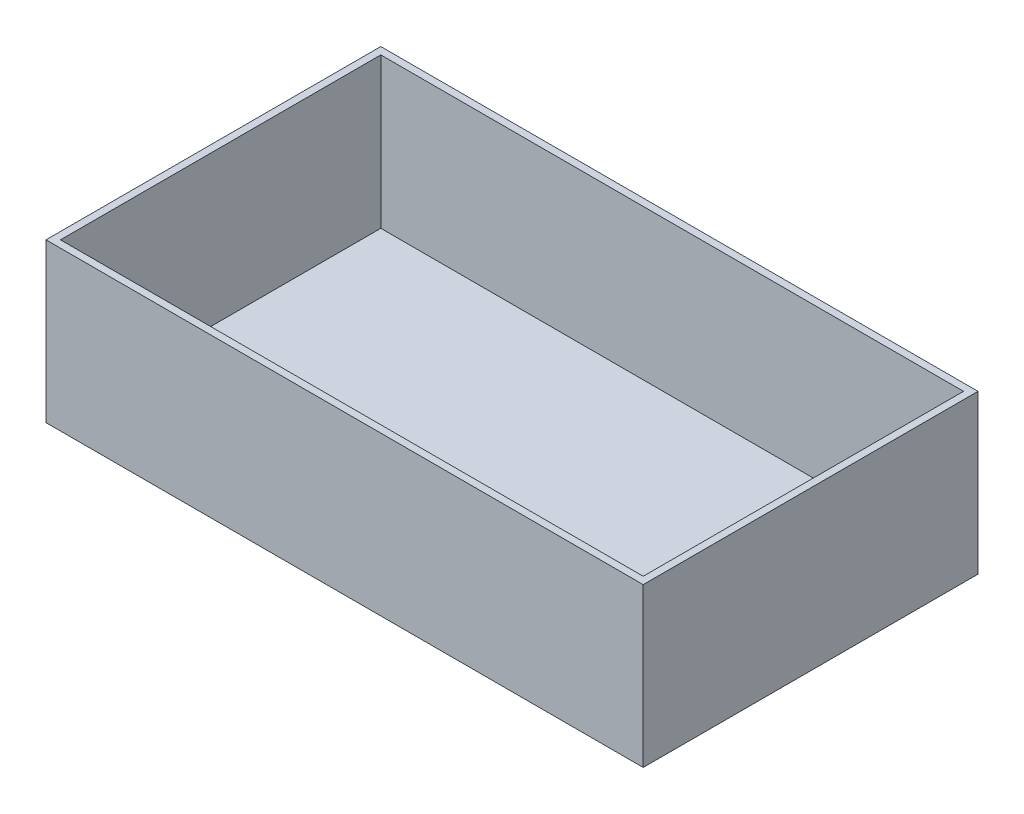
ISO-10303-21;
HEADER;
FILE_DESCRIPTION(('STEP AP214'),'2;1');
FILE_NAME('part.step','',(''),(''),'','','');
FILE_SCHEMA(('AUTOMOTIVE_DESIGN { 1 0 10303 214 1 1 1 1 }'));
ENDSEC;
DATA;
#1=APPLICATION_CONTEXT('core data for automotive mechanical design processes');
#2=APPLICATION_PROTOCOL_DEFINITION('international standard','automotive_design',2000,#1);
#3=PRODUCT_CONTEXT('',#1,'mechanical');
#4=PRODUCT('Part','Part','',(#3));
#5=PRODUCT_RELATED_PRODUCT_CATEGORY('part','',(#4));
#6=PRODUCT_DEFINITION_FORMATION('','',#4);
#7=PRODUCT_DEFINITION_CONTEXT('part definition',#1,'design');
#8=PRODUCT_DEFINITION('design','',#6,#7);
#9=PRODUCT_DEFINITION_SHAPE('','',#8);
#10=(LENGTH_UNIT() NAMED_UNIT(*) SI_UNIT(.MILLI.,.METRE.));
#11=(NAMED_UNIT(*) PLANE_ANGLE_UNIT() SI_UNIT($,.RADIAN.));
#12=(NAMED_UNIT(*) SI_UNIT($,.STERADIAN.) SOLID_ANGLE_UNIT());
#13=UNCERTAINTY_MEASURE_WITH_UNIT(LENGTH_MEASURE(1.E-05),#10,'distance_accuracy_value','');
#14=(GEOMETRIC_REPRESENTATION_CONTEXT(3) GLOBAL_UNCERTAINTY_ASSIGNED_CONTEXT((#13)) GLOBAL_UNIT_ASSIGNED_CONTEXT((#10,
#11,#12)) REPRESENTATION_CONTEXT('',''));
#15=CARTESIAN_POINT('',(0.,0.,0.));
#16=DIRECTION('',(0.,0.,1.));
#17=DIRECTION('',(1.,0.,0.));
#18=AXIS2_PLACEMENT_3D('',#15,#16,#17);
#19=CARTESIAN_POINT('',(660.,350.,370.));
#20=DIRECTION('',(-1.,0.,0.));
#21=DIRECTION('',(0.,0.,1.));
#22=AXIS2_PLACEMENT_3D('',#19,#20,#21);
#23=PLANE('',#22);
#24=DIRECTION('',(0.,0.,-1.));
#25=VECTOR('',#24,1.);
#26=CARTESIAN_POINT('',(660.,0.,370.));
#27=LINE('',#26,#25);
#28=CARTESIAN_POINT('',(660.,0.,370.));
#29=VERTEX_POINT('',#28);
#30=CARTESIAN_POINT('',(660.,0.,-370.));
#31=VERTEX_POINT('',#30);
#32=EDGE_CURVE('E140',#29,#31,#27,.T.);
#33=ORIENTED_EDGE('',*,*,#32,.T.);
#34=DIRECTION('',(0.,-1.,0.));
#35=VECTOR('',#34,1.);
#36=CARTESIAN_POINT('',(660.,350.,-370.));
#37=LINE('',#36,#35);
#38=CARTESIAN_POINT('',(660.,350.,-370.));
#39=VERTEX_POINT('',#38);
#40=EDGE_CURVE('E11',#39,#31,#37,.T.);
#41=ORIENTED_EDGE('',*,*,#40,.F.);
#42=DIRECTION('',(0.,0.,-1.));
#43=VECTOR('',#42,1.);
#44=CARTESIAN_POINT('',(660.,350.,370.));
#45=LINE('',#44,#43);
#46=CARTESIAN_POINT('',(660.,350.,370.));
#47=VERTEX_POINT('',#46);
#48=EDGE_CURVE('E144',#47,#39,#45,.T.);
#49=ORIENTED_EDGE('',*,*,#48,.F.);
#50=DIRECTION('',(0.,-1.,0.));
#51=VECTOR('',#50,1.);
#52=CARTESIAN_POINT('',(660.,350.,370.));
#53=LINE('',#52,#51);
#54=EDGE_CURVE('E150',#47,#29,#53,.T.);
#55=ORIENTED_EDGE('',*,*,#54,.T.);
#56=EDGE_LOOP('',(#33,#41,#49,#55));
#57=FACE_BOUND('',#56,.T.);
#58=ADVANCED_FACE('F32',(#57),#23,.F.);
#59=CARTESIAN_POINT('',(-660.,350.,-370.));
#60=DIRECTION('',(0.,0.,1.));
#61=DIRECTION('',(1.,0.,0.));
#62=AXIS2_PLACEMENT_3D('',#59,#60,#61);
#63=PLANE('',#62);
#64=DIRECTION('',(-1.,0.,0.));
#65=VECTOR('',#64,1.);
#66=CARTESIAN_POINT('',(-660.,0.,-370.));
#67=LINE('',#66,#65);
#68=CARTESIAN_POINT('',(-660.,0.,-370.));
#69=VERTEX_POINT('',#68);
#70=EDGE_CURVE('E153',#31,#69,#67,.T.);
#71=ORIENTED_EDGE('',*,*,#70,.T.);
#72=DIRECTION('',(0.,-1.,0.));
#73=VECTOR('',#72,1.);
#74=CARTESIAN_POINT('',(-660.,350.,-370.));
#75=LINE('',#74,#73);
#76=CARTESIAN_POINT('',(-660.,350.,-370.));
#77=VERTEX_POINT('',#76);
#78=EDGE_CURVE('E39',#77,#69,#75,.T.);
#79=ORIENTED_EDGE('',*,*,#78,.F.);
#80=DIRECTION('',(-1.,0.,0.));
#81=VECTOR('',#80,1.);
#82=CARTESIAN_POINT('',(-660.,350.,-370.));
#83=LINE('',#82,#81);
#84=EDGE_CURVE('E83',#39,#77,#83,.T.);
#85=ORIENTED_EDGE('',*,*,#84,.F.);
#86=ORIENTED_EDGE('',*,*,#40,.T.);
#87=EDGE_LOOP('',(#71,#79,#85,#86));
#88=FACE_BOUND('',#87,.T.);
#89=ADVANCED_FACE('F182',(#88),#63,.F.);
#90=CARTESIAN_POINT('',(-660.,350.,370.));
#91=DIRECTION('',(1.,0.,0.));
#92=DIRECTION('',(0.,0.,-1.));
#93=AXIS2_PLACEMENT_3D('',#90,#91,#92);
#94=PLANE('',#93);
#95=DIRECTION('',(0.,0.,1.));
#96=VECTOR('',#95,1.);
#97=CARTESIAN_POINT('',(-660.,0.,370.));
#98=LINE('',#97,#96);
#99=CARTESIAN_POINT('',(-660.,0.,370.));
#100=VERTEX_POINT('',#99);
#101=EDGE_CURVE('E155',#69,#100,#98,.T.);
#102=ORIENTED_EDGE('',*,*,#101,.T.);
#103=DIRECTION('',(0.,-1.,0.));
#104=VECTOR('',#103,1.);
#105=CARTESIAN_POINT('',(-660.,350.,370.));
#106=LINE('',#105,#104);
#107=CARTESIAN_POINT('',(-660.,350.,370.));
#108=VERTEX_POINT('',#107);
#109=EDGE_CURVE('E159',#108,#100,#106,.T.);
#110=ORIENTED_EDGE('',*,*,#109,.F.);
#111=DIRECTION('',(0.,0.,1.));
#112=VECTOR('',#111,1.);
#113=CARTESIAN_POINT('',(-660.,350.,370.));
#114=LINE('',#113,#112);
#115=EDGE_CURVE('E147',#77,#108,#114,.T.);
#116=ORIENTED_EDGE('',*,*,#115,.F.);
#117=ORIENTED_EDGE('',*,*,#78,.T.);
#118=EDGE_LOOP('',(#102,#110,#116,#117));
#119=FACE_BOUND('',#118,.T.);
#120=ADVANCED_FACE('F164',(#119),#94,.F.);
#121=CARTESIAN_POINT('',(-660.,350.,370.));
#122=DIRECTION('',(0.,0.,-1.));
#123=DIRECTION('',(-1.,0.,0.));
#124=AXIS2_PLACEMENT_3D('',#121,#122,#123);
#125=PLANE('',#124);
#126=DIRECTION('',(1.,0.,0.));
#127=VECTOR('',#126,1.);
#128=CARTESIAN_POINT('',(-660.,0.,370.));
#129=LINE('',#128,#127);
#130=EDGE_CURVE('E76',#100,#29,#129,.T.);
#131=ORIENTED_EDGE('',*,*,#130,.T.);
#132=ORIENTED_EDGE('',*,*,#54,.F.);
#133=DIRECTION('',(1.,0.,0.));
#134=VECTOR('',#133,1.);
#135=CARTESIAN_POINT('',(-660.,350.,370.));
#136=LINE('',#135,#134);
#137=EDGE_CURVE('E55',#108,#47,#136,.T.);
#138=ORIENTED_EDGE('',*,*,#137,.F.);
#139=ORIENTED_EDGE('',*,*,#109,.T.);
#140=EDGE_LOOP('',(#131,#132,#138,#139));
#141=FACE_BOUND('',#140,.T.);
#142=ADVANCED_FACE('F172',(#141),#125,.F.);
#143=CARTESIAN_POINT('',(0.,350.,0.));
#144=DIRECTION('',(0.,-1.,0.));
#145=DIRECTION('',(0.,0.,-1.));
#146=AXIS2_PLACEMENT_3D('',#143,#144,#145);
#147=PLANE('',#146);
#148=DIRECTION('',(-1.,0.,0.));
#149=VECTOR('',#148,1.);
#150=CARTESIAN_POINT('',(-644.,350.,-354.));
#151=LINE('',#150,#149);
#152=CARTESIAN_POINT('',(644.,350.,-354.));
#153=VERTEX_POINT('',#152);
#154=CARTESIAN_POINT('',(-644.,350.,-354.));
#155=VERTEX_POINT('',#154);
#156=EDGE_CURVE('E134',#153,#155,#151,.T.);
#157=ORIENTED_EDGE('',*,*,#156,.F.);
#158=DIRECTION('',(0.,0.,-1.));
#159=VECTOR('',#158,1.);
#160=CARTESIAN_POINT('',(644.,350.,354.));
#161=LINE('',#160,#159);
#162=CARTESIAN_POINT('',(644.,350.,354.));
#163=VERTEX_POINT('',#162);
#164=EDGE_CURVE('E46',#163,#153,#161,.T.);
#165=ORIENTED_EDGE('',*,*,#164,.F.);
#166=DIRECTION('',(1.,0.,0.));
#167=VECTOR('',#166,1.);
#168=CARTESIAN_POINT('',(-644.,350.,354.));
#169=LINE('',#168,#167);
#170=CARTESIAN_POINT('',(-644.,350.,354.));
#171=VERTEX_POINT('',#170);
#172=EDGE_CURVE('E125',#171,#163,#169,.T.);
#173=ORIENTED_EDGE('',*,*,#172,.F.);
#174=DIRECTION('',(0.,0.,1.));
#175=VECTOR('',#174,1.);
#176=CARTESIAN_POINT('',(-644.,350.,354.));
#177=LINE('',#176,#175);
#178=EDGE_CURVE('E128',#155,#171,#177,.T.);
#179=ORIENTED_EDGE('',*,*,#178,.F.);
#180=EDGE_LOOP('',(#157,#165,#173,#179));
#181=FACE_BOUND('',#180,.T.);
#182=ORIENTED_EDGE('',*,*,#48,.T.);
#183=ORIENTED_EDGE('',*,*,#84,.T.);
#184=ORIENTED_EDGE('',*,*,#115,.T.);
#185=ORIENTED_EDGE('',*,*,#137,.T.);
#186=EDGE_LOOP('',(#182,#183,#184,#185));
#187=FACE_BOUND('',#186,.T.);
#188=ADVANCED_FACE('F174',(#181,#187),#147,.F.);
#189=CARTESIAN_POINT('',(0.,0.,0.));
#190=DIRECTION('',(0.,-1.,0.));
#191=DIRECTION('',(0.,0.,-1.));
#192=AXIS2_PLACEMENT_3D('',#189,#190,#191);
#193=PLANE('',#192);
#194=ORIENTED_EDGE('',*,*,#32,.F.);
#195=ORIENTED_EDGE('',*,*,#130,.F.);
#196=ORIENTED_EDGE('',*,*,#101,.F.);
#197=ORIENTED_EDGE('',*,*,#70,.F.);
#198=EDGE_LOOP('',(#194,#195,#196,#197));
#199=FACE_BOUND('',#198,.T.);
#200=ADVANCED_FACE('F168',(#199),#193,.T.);
#201=CARTESIAN_POINT('',(644.,18.,354.));
#202=DIRECTION('',(1.,0.,0.));
#203=DIRECTION('',(0.,0.,-1.));
#204=AXIS2_PLACEMENT_3D('',#201,#202,#203);
#205=PLANE('',#204);
#206=ORIENTED_EDGE('',*,*,#164,.T.);
#207=DIRECTION('',(0.,1.,0.));
#208=VECTOR('',#207,1.);
#209=CARTESIAN_POINT('',(644.,18.,-354.));
#210=LINE('',#209,#208);
#211=CARTESIAN_POINT('',(644.,18.,-354.));
#212=VERTEX_POINT('',#211);
#213=EDGE_CURVE('E103',#212,#153,#210,.T.);
#214=ORIENTED_EDGE('',*,*,#213,.F.);
#215=DIRECTION('',(0.,0.,-1.));
#216=VECTOR('',#215,1.);
#217=CARTESIAN_POINT('',(644.,18.,354.));
#218=LINE('',#217,#216);
#219=CARTESIAN_POINT('',(644.,18.,354.));
#220=VERTEX_POINT('',#219);
#221=EDGE_CURVE('E107',#220,#212,#218,.T.);
#222=ORIENTED_EDGE('',*,*,#221,.F.);
#223=DIRECTION('',(0.,1.,0.));
#224=VECTOR('',#223,1.);
#225=CARTESIAN_POINT('',(644.,18.,354.));
#226=LINE('',#225,#224);
#227=EDGE_CURVE('E138',#220,#163,#226,.T.);
#228=ORIENTED_EDGE('',*,*,#227,.T.);
#229=EDGE_LOOP('',(#206,#214,#222,#228));
#230=FACE_BOUND('',#229,.T.);
#231=ADVANCED_FACE('F105',(#230),#205,.F.);
#232=CARTESIAN_POINT('',(-644.,18.,354.));
#233=DIRECTION('',(0.,0.,1.));
#234=DIRECTION('',(1.,0.,0.));
#235=AXIS2_PLACEMENT_3D('',#232,#233,#234);
#236=PLANE('',#235);
#237=ORIENTED_EDGE('',*,*,#172,.T.);
#238=ORIENTED_EDGE('',*,*,#227,.F.);
#239=DIRECTION('',(1.,0.,0.));
#240=VECTOR('',#239,1.);
#241=CARTESIAN_POINT('',(-644.,18.,354.));
#242=LINE('',#241,#240);
#243=CARTESIAN_POINT('',(-644.,18.,354.));
#244=VERTEX_POINT('',#243);
#245=EDGE_CURVE('E113',#244,#220,#242,.T.);
#246=ORIENTED_EDGE('',*,*,#245,.F.);
#247=DIRECTION('',(0.,1.,0.));
#248=VECTOR('',#247,1.);
#249=CARTESIAN_POINT('',(-644.,18.,354.));
#250=LINE('',#249,#248);
#251=EDGE_CURVE('E141',#244,#171,#250,.T.);
#252=ORIENTED_EDGE('',*,*,#251,.T.);
#253=EDGE_LOOP('',(#237,#238,#246,#252));
#254=FACE_BOUND('',#253,.T.);
#255=ADVANCED_FACE('F221',(#254),#236,.F.);
#256=CARTESIAN_POINT('',(-644.,18.,354.));
#257=DIRECTION('',(-1.,0.,0.));
#258=DIRECTION('',(0.,0.,1.));
#259=AXIS2_PLACEMENT_3D('',#256,#257,#258);
#260=PLANE('',#259);
#261=ORIENTED_EDGE('',*,*,#178,.T.);
#262=ORIENTED_EDGE('',*,*,#251,.F.);
#263=DIRECTION('',(0.,0.,1.));
#264=VECTOR('',#263,1.);
#265=CARTESIAN_POINT('',(-644.,18.,354.));
#266=LINE('',#265,#264);
#267=CARTESIAN_POINT('',(-644.,18.,-354.));
#268=VERTEX_POINT('',#267);
#269=EDGE_CURVE('E121',#268,#244,#266,.T.);
#270=ORIENTED_EDGE('',*,*,#269,.F.);
#271=DIRECTION('',(0.,1.,0.));
#272=VECTOR('',#271,1.);
#273=CARTESIAN_POINT('',(-644.,18.,-354.));
#274=LINE('',#273,#272);
#275=EDGE_CURVE('E112',#268,#155,#274,.T.);
#276=ORIENTED_EDGE('',*,*,#275,.T.);
#277=EDGE_LOOP('',(#261,#262,#270,#276));
#278=FACE_BOUND('',#277,.T.);
#279=ADVANCED_FACE('F230',(#278),#260,.F.);
#280=CARTESIAN_POINT('',(-644.,18.,-354.));
#281=DIRECTION('',(0.,0.,-1.));
#282=DIRECTION('',(-1.,0.,0.));
#283=AXIS2_PLACEMENT_3D('',#280,#281,#282);
#284=PLANE('',#283);
#285=ORIENTED_EDGE('',*,*,#156,.T.);
#286=ORIENTED_EDGE('',*,*,#275,.F.);
#287=DIRECTION('',(-1.,0.,0.));
#288=VECTOR('',#287,1.);
#289=CARTESIAN_POINT('',(-644.,18.,-354.));
#290=LINE('',#289,#288);
#291=EDGE_CURVE('E116',#212,#268,#290,.T.);
#292=ORIENTED_EDGE('',*,*,#291,.F.);
#293=ORIENTED_EDGE('',*,*,#213,.T.);
#294=EDGE_LOOP('',(#285,#286,#292,#293));
#295=FACE_BOUND('',#294,.T.);
#296=ADVANCED_FACE('F117',(#295),#284,.F.);
#297=CARTESIAN_POINT('',(0.,18.,0.));
#298=DIRECTION('',(0.,-1.,0.));
#299=DIRECTION('',(0.,0.,-1.));
#300=AXIS2_PLACEMENT_3D('',#297,#298,#299);
#301=PLANE('',#300);
#302=ORIENTED_EDGE('',*,*,#221,.T.);
#303=ORIENTED_EDGE('',*,*,#291,.T.);
#304=ORIENTED_EDGE('',*,*,#269,.T.);
#305=ORIENTED_EDGE('',*,*,#245,.T.);
#306=EDGE_LOOP('',(#302,#303,#304,#305));
#307=FACE_BOUND('',#306,.T.);
#308=ADVANCED_FACE('F123',(#307),#301,.F.);
#309=CLOSED_SHELL('',(#58,#89,#120,#142,#188,#200,#231,#255,#279,#296,#308));
#310=MANIFOLD_SOLID_BREP('B2',#309);
#311=ADVANCED_BREP_SHAPE_REPRESENTATION('',(#18,#310),#14);
#312=SHAPE_DEFINITION_REPRESENTATION(#9,#311);
ENDSEC;
END-ISO-10303-21;
